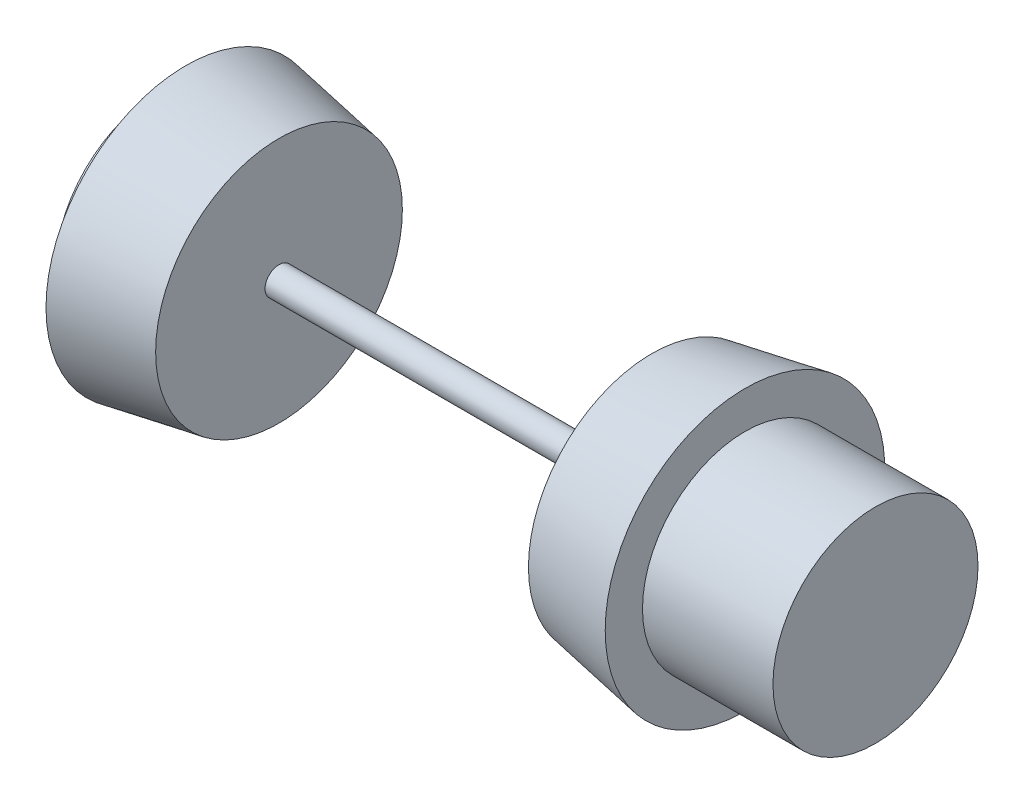
ISO-10303-21;
HEADER;
FILE_DESCRIPTION(('STEP AP214'),'2;1');
FILE_NAME('part.step','',(''),(''),'','','');
FILE_SCHEMA(('AUTOMOTIVE_DESIGN { 1 0 10303 214 1 1 1 1 }'));
ENDSEC;
DATA;
#1=APPLICATION_CONTEXT('core data for automotive mechanical design processes');
#2=APPLICATION_PROTOCOL_DEFINITION('international standard','automotive_design',2000,#1);
#3=PRODUCT_CONTEXT('',#1,'mechanical');
#4=PRODUCT('Part','Part','',(#3));
#5=PRODUCT_RELATED_PRODUCT_CATEGORY('part','',(#4));
#6=PRODUCT_DEFINITION_FORMATION('','',#4);
#7=PRODUCT_DEFINITION_CONTEXT('part definition',#1,'design');
#8=PRODUCT_DEFINITION('design','',#6,#7);
#9=PRODUCT_DEFINITION_SHAPE('','',#8);
#10=(LENGTH_UNIT() NAMED_UNIT(*) SI_UNIT(.MILLI.,.METRE.));
#11=(NAMED_UNIT(*) PLANE_ANGLE_UNIT() SI_UNIT($,.RADIAN.));
#12=(NAMED_UNIT(*) SI_UNIT($,.STERADIAN.) SOLID_ANGLE_UNIT());
#13=UNCERTAINTY_MEASURE_WITH_UNIT(LENGTH_MEASURE(1.E-05),#10,'distance_accuracy_value','');
#14=(GEOMETRIC_REPRESENTATION_CONTEXT(3) GLOBAL_UNCERTAINTY_ASSIGNED_CONTEXT((#13)) GLOBAL_UNIT_ASSIGNED_CONTEXT((#10,
#11,#12)) REPRESENTATION_CONTEXT('',''));
#15=CARTESIAN_POINT('',(0.,0.,0.));
#16=DIRECTION('',(0.,0.,1.));
#17=DIRECTION('',(1.,0.,0.));
#18=AXIS2_PLACEMENT_3D('',#15,#16,#17);
#19=CARTESIAN_POINT('',(30.,0.,0.));
#20=DIRECTION('',(-1.,0.,0.));
#21=DIRECTION('',(0.,0.,1.));
#22=AXIS2_PLACEMENT_3D('',#19,#20,#21);
#23=CYLINDRICAL_SURFACE('',#22,1.5);
#24=CARTESIAN_POINT('',(-20.,0.,0.));
#25=DIRECTION('',(1.,0.,0.));
#26=DIRECTION('',(0.,0.,-1.));
#27=AXIS2_PLACEMENT_3D('',#24,#25,#26);
#28=CIRCLE('',#27,1.5);
#29=CARTESIAN_POINT('',(-20.,0.,-1.5));
#30=VERTEX_POINT('',#29);
#31=EDGE_CURVE('E48',#30,#30,#28,.T.);
#32=ORIENTED_EDGE('',*,*,#31,.T.);
#33=EDGE_LOOP('',(#32));
#34=FACE_BOUND('',#33,.T.);
#35=CARTESIAN_POINT('',(20.,0.,0.));
#36=DIRECTION('',(-1.,0.,0.));
#37=DIRECTION('',(0.,0.,1.));
#38=AXIS2_PLACEMENT_3D('',#35,#36,#37);
#39=CIRCLE('',#38,1.5);
#40=CARTESIAN_POINT('',(20.,0.,1.5));
#41=VERTEX_POINT('',#40);
#42=EDGE_CURVE('E59',#41,#41,#39,.T.);
#43=ORIENTED_EDGE('',*,*,#42,.T.);
#44=EDGE_LOOP('',(#43));
#45=FACE_BOUND('',#44,.T.);
#46=ADVANCED_FACE('F45',(#34,#45),#23,.T.);
#47=CARTESIAN_POINT('',(30.,0.,0.));
#48=DIRECTION('',(1.,0.,0.));
#49=DIRECTION('',(0.,0.,1.));
#50=AXIS2_PLACEMENT_3D('',#47,#48,#49);
#51=CONICAL_SURFACE('',#50,15.,0.174532925199433);
#52=CARTESIAN_POINT('',(20.,0.,0.));
#53=DIRECTION('',(-1.,0.,0.));
#54=DIRECTION('',(0.,0.,1.));
#55=AXIS2_PLACEMENT_3D('',#52,#53,#54);
#56=CIRCLE('',#55,13.2367301929153);
#57=CARTESIAN_POINT('',(20.,0.,13.2367301929153));
#58=VERTEX_POINT('',#57);
#59=EDGE_CURVE('E76',#58,#58,#56,.T.);
#60=ORIENTED_EDGE('',*,*,#59,.F.);
#61=EDGE_LOOP('',(#60));
#62=FACE_BOUND('',#61,.T.);
#63=CARTESIAN_POINT('',(30.,0.,0.));
#64=DIRECTION('',(-1.,0.,0.));
#65=DIRECTION('',(0.,0.,1.));
#66=AXIS2_PLACEMENT_3D('',#63,#64,#65);
#67=CIRCLE('',#66,15.);
#68=CARTESIAN_POINT('',(30.,0.,15.));
#69=VERTEX_POINT('',#68);
#70=EDGE_CURVE('E72',#69,#69,#67,.T.);
#71=ORIENTED_EDGE('',*,*,#70,.T.);
#72=EDGE_LOOP('',(#71));
#73=FACE_BOUND('',#72,.T.);
#74=ADVANCED_FACE('F92',(#62,#73),#51,.T.);
#75=CARTESIAN_POINT('',(20.,0.,0.));
#76=DIRECTION('',(-1.,0.,0.));
#77=DIRECTION('',(0.,0.,1.));
#78=AXIS2_PLACEMENT_3D('',#75,#76,#77);
#79=PLANE('',#78);
#80=ORIENTED_EDGE('',*,*,#42,.F.);
#81=EDGE_LOOP('',(#80));
#82=FACE_BOUND('',#81,.T.);
#83=ORIENTED_EDGE('',*,*,#59,.T.);
#84=EDGE_LOOP('',(#83));
#85=FACE_BOUND('',#84,.T.);
#86=ADVANCED_FACE('F88',(#82,#85),#79,.T.);
#87=CARTESIAN_POINT('',(30.,0.,0.));
#88=DIRECTION('',(-1.,0.,0.));
#89=DIRECTION('',(0.,0.,1.));
#90=AXIS2_PLACEMENT_3D('',#87,#88,#89);
#91=PLANE('',#90);
#92=CARTESIAN_POINT('',(30.,0.,0.));
#93=DIRECTION('',(-1.,0.,0.));
#94=DIRECTION('',(0.,0.,1.));
#95=AXIS2_PLACEMENT_3D('',#92,#93,#94);
#96=CIRCLE('',#95,11.);
#97=CARTESIAN_POINT('',(30.,0.,11.));
#98=VERTEX_POINT('',#97);
#99=EDGE_CURVE('E80',#98,#98,#96,.T.);
#100=ORIENTED_EDGE('',*,*,#99,.T.);
#101=EDGE_LOOP('',(#100));
#102=FACE_BOUND('',#101,.T.);
#103=ORIENTED_EDGE('',*,*,#70,.F.);
#104=EDGE_LOOP('',(#103));
#105=FACE_BOUND('',#104,.T.);
#106=ADVANCED_FACE('F91',(#102,#105),#91,.F.);
#107=CARTESIAN_POINT('',(44.,0.,0.));
#108=DIRECTION('',(1.,0.,0.));
#109=DIRECTION('',(0.,0.,-1.));
#110=AXIS2_PLACEMENT_3D('',#107,#108,#109);
#111=PLANE('',#110);
#112=CARTESIAN_POINT('',(44.,0.,0.));
#113=DIRECTION('',(1.,0.,0.));
#114=DIRECTION('',(0.,0.,-1.));
#115=AXIS2_PLACEMENT_3D('',#112,#113,#114);
#116=CIRCLE('',#115,11.);
#117=CARTESIAN_POINT('',(44.,0.,-11.));
#118=VERTEX_POINT('',#117);
#119=EDGE_CURVE('E53',#118,#118,#116,.T.);
#120=ORIENTED_EDGE('',*,*,#119,.T.);
#121=EDGE_LOOP('',(#120));
#122=FACE_BOUND('',#121,.T.);
#123=ADVANCED_FACE('F102',(#122),#111,.T.);
#124=CARTESIAN_POINT('',(44.,0.,0.));
#125=DIRECTION('',(-1.,0.,0.));
#126=DIRECTION('',(0.,0.,1.));
#127=AXIS2_PLACEMENT_3D('',#124,#125,#126);
#128=CYLINDRICAL_SURFACE('',#127,11.);
#129=ORIENTED_EDGE('',*,*,#119,.F.);
#130=EDGE_LOOP('',(#129));
#131=FACE_BOUND('',#130,.T.);
#132=ORIENTED_EDGE('',*,*,#99,.F.);
#133=EDGE_LOOP('',(#132));
#134=FACE_BOUND('',#133,.T.);
#135=ADVANCED_FACE('F108',(#131,#134),#128,.T.);
#136=CARTESIAN_POINT('',(-30.,0.,0.));
#137=DIRECTION('',(-1.,0.,0.));
#138=DIRECTION('',(0.,0.,1.));
#139=AXIS2_PLACEMENT_3D('',#136,#137,#138);
#140=CONICAL_SURFACE('',#139,15.,0.174532925199433);
#141=CARTESIAN_POINT('',(-20.,0.,0.));
#142=DIRECTION('',(1.,0.,0.));
#143=DIRECTION('',(0.,0.,-1.));
#144=AXIS2_PLACEMENT_3D('',#141,#142,#143);
#145=CIRCLE('',#144,13.2367301929153);
#146=CARTESIAN_POINT('',(-20.,0.,-13.2367301929153));
#147=VERTEX_POINT('',#146);
#148=EDGE_CURVE('E68',#147,#147,#145,.F.);
#149=ORIENTED_EDGE('',*,*,#148,.T.);
#150=EDGE_LOOP('',(#149));
#151=FACE_BOUND('',#150,.T.);
#152=CARTESIAN_POINT('',(-30.,0.,0.));
#153=DIRECTION('',(-1.,0.,0.));
#154=DIRECTION('',(0.,0.,1.));
#155=AXIS2_PLACEMENT_3D('',#152,#153,#154);
#156=CIRCLE('',#155,15.);
#157=CARTESIAN_POINT('',(-30.,0.,15.));
#158=VERTEX_POINT('',#157);
#159=EDGE_CURVE('E64',#158,#158,#156,.T.);
#160=ORIENTED_EDGE('',*,*,#159,.F.);
#161=EDGE_LOOP('',(#160));
#162=FACE_BOUND('',#161,.T.);
#163=ADVANCED_FACE('F140',(#151,#162),#140,.T.);
#164=CARTESIAN_POINT('',(-20.,0.,0.));
#165=DIRECTION('',(1.,0.,0.));
#166=DIRECTION('',(0.,0.,1.));
#167=AXIS2_PLACEMENT_3D('',#164,#165,#166);
#168=PLANE('',#167);
#169=ORIENTED_EDGE('',*,*,#31,.F.);
#170=EDGE_LOOP('',(#169));
#171=FACE_BOUND('',#170,.T.);
#172=ORIENTED_EDGE('',*,*,#148,.F.);
#173=EDGE_LOOP('',(#172));
#174=FACE_BOUND('',#173,.T.);
#175=ADVANCED_FACE('F134',(#171,#174),#168,.T.);
#176=CARTESIAN_POINT('',(-30.,0.,0.));
#177=DIRECTION('',(-1.,0.,0.));
#178=DIRECTION('',(0.,0.,-1.));
#179=AXIS2_PLACEMENT_3D('',#176,#177,#178);
#180=PLANE('',#179);
#181=CARTESIAN_POINT('',(-30.,0.,0.));
#182=DIRECTION('',(-1.,0.,0.));
#183=DIRECTION('',(0.,0.,1.));
#184=AXIS2_PLACEMENT_3D('',#181,#182,#183);
#185=CIRCLE('',#184,11.);
#186=CARTESIAN_POINT('',(-30.,0.,11.));
#187=VERTEX_POINT('',#186);
#188=EDGE_CURVE('E10',#187,#187,#185,.T.);
#189=ORIENTED_EDGE('',*,*,#188,.F.);
#190=EDGE_LOOP('',(#189));
#191=FACE_BOUND('',#190,.T.);
#192=ORIENTED_EDGE('',*,*,#159,.T.);
#193=EDGE_LOOP('',(#192));
#194=FACE_BOUND('',#193,.T.);
#195=ADVANCED_FACE('F127',(#191,#194),#180,.T.);
#196=CARTESIAN_POINT('',(-33.,0.,0.));
#197=DIRECTION('',(1.,0.,0.));
#198=DIRECTION('',(0.,0.,-1.));
#199=AXIS2_PLACEMENT_3D('',#196,#197,#198);
#200=CYLINDRICAL_SURFACE('',#199,11.);
#201=CARTESIAN_POINT('',(-33.,0.,0.));
#202=DIRECTION('',(-1.,0.,0.));
#203=DIRECTION('',(0.,0.,1.));
#204=AXIS2_PLACEMENT_3D('',#201,#202,#203);
#205=CIRCLE('',#204,11.);
#206=CARTESIAN_POINT('',(-33.,0.,11.));
#207=VERTEX_POINT('',#206);
#208=EDGE_CURVE('E63',#207,#207,#205,.T.);
#209=ORIENTED_EDGE('',*,*,#208,.F.);
#210=EDGE_LOOP('',(#209));
#211=FACE_BOUND('',#210,.T.);
#212=ORIENTED_EDGE('',*,*,#188,.T.);
#213=EDGE_LOOP('',(#212));
#214=FACE_BOUND('',#213,.T.);
#215=ADVANCED_FACE('F125',(#211,#214),#200,.T.);
#216=CARTESIAN_POINT('',(-33.,0.,0.));
#217=DIRECTION('',(-1.,0.,0.));
#218=DIRECTION('',(0.,0.,1.));
#219=AXIS2_PLACEMENT_3D('',#216,#217,#218);
#220=PLANE('',#219);
#221=ORIENTED_EDGE('',*,*,#208,.T.);
#222=EDGE_LOOP('',(#221));
#223=FACE_BOUND('',#222,.T.);
#224=ADVANCED_FACE('F123',(#223),#220,.T.);
#225=CLOSED_SHELL('',(#46,#74,#86,#106,#123,#135,#163,#175,#195,#215,#224));
#226=MANIFOLD_SOLID_BREP('B2',#225);
#227=ADVANCED_BREP_SHAPE_REPRESENTATION('',(#18,#226),#14);
#228=SHAPE_DEFINITION_REPRESENTATION(#9,#227);
ENDSEC;
END-ISO-10303-21;
